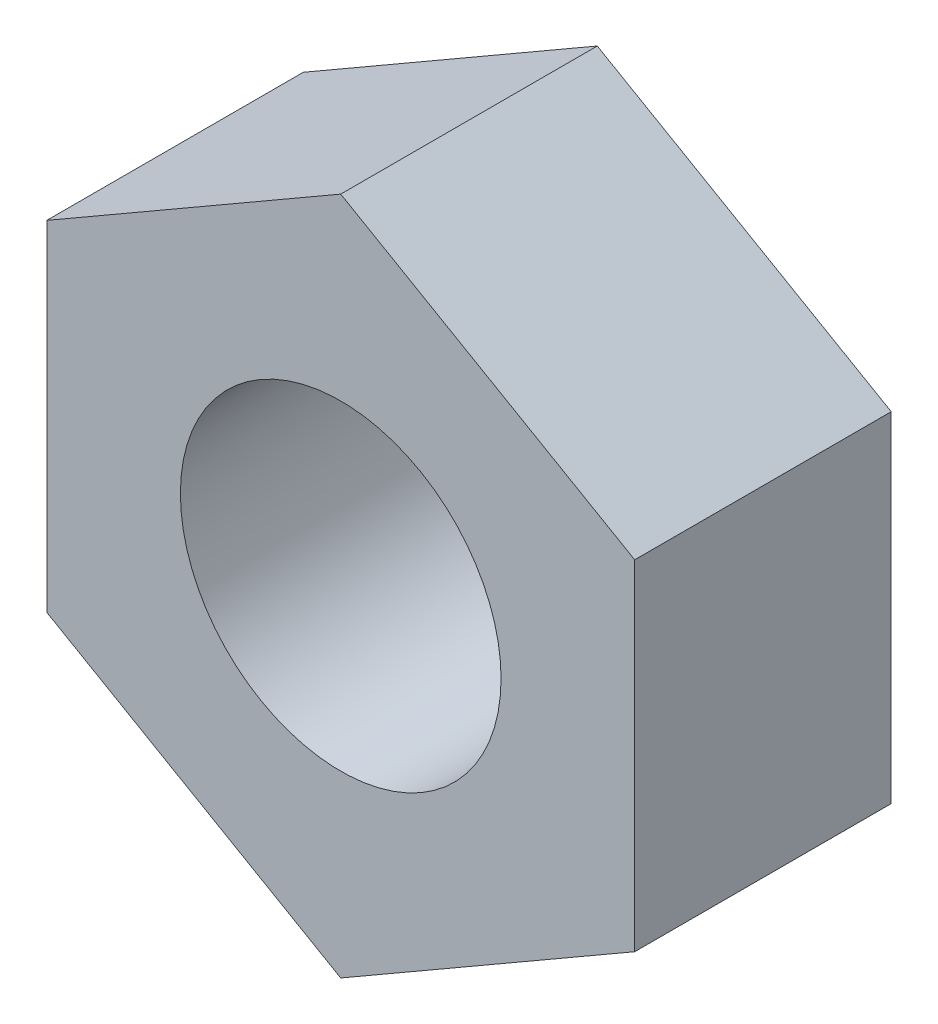
ISO-10303-21;
HEADER;
FILE_DESCRIPTION(('STEP AP214'),'2;1');
FILE_NAME('part.step','',(''),(''),'','','');
FILE_SCHEMA(('AUTOMOTIVE_DESIGN { 1 0 10303 214 1 1 1 1 }'));
ENDSEC;
DATA;
#1=APPLICATION_CONTEXT('core data for automotive mechanical design processes');
#2=APPLICATION_PROTOCOL_DEFINITION('international standard','automotive_design',2000,#1);
#3=PRODUCT_CONTEXT('',#1,'mechanical');
#4=PRODUCT('Part','Part','',(#3));
#5=PRODUCT_RELATED_PRODUCT_CATEGORY('part','',(#4));
#6=PRODUCT_DEFINITION_FORMATION('','',#4);
#7=PRODUCT_DEFINITION_CONTEXT('part definition',#1,'design');
#8=PRODUCT_DEFINITION('design','',#6,#7);
#9=PRODUCT_DEFINITION_SHAPE('','',#8);
#10=(LENGTH_UNIT() NAMED_UNIT(*) SI_UNIT(.MILLI.,.METRE.));
#11=(NAMED_UNIT(*) PLANE_ANGLE_UNIT() SI_UNIT($,.RADIAN.));
#12=(NAMED_UNIT(*) SI_UNIT($,.STERADIAN.) SOLID_ANGLE_UNIT());
#13=UNCERTAINTY_MEASURE_WITH_UNIT(LENGTH_MEASURE(1.E-05),#10,'distance_accuracy_value','');
#14=(GEOMETRIC_REPRESENTATION_CONTEXT(3) GLOBAL_UNCERTAINTY_ASSIGNED_CONTEXT((#13)) GLOBAL_UNIT_ASSIGNED_CONTEXT((#10,
#11,#12)) REPRESENTATION_CONTEXT('',''));
#15=CARTESIAN_POINT('',(0.,0.,0.));
#16=DIRECTION('',(0.,0.,1.));
#17=DIRECTION('',(1.,0.,0.));
#18=AXIS2_PLACEMENT_3D('',#15,#16,#17);
#19=CARTESIAN_POINT('',(-2.74999999999998,-1.5877132402715,2.4));
#20=DIRECTION('',(0.499999999999995,0.866025403784441,0.));
#21=DIRECTION('',(-0.866025403784441,0.499999999999995,0.));
#22=AXIS2_PLACEMENT_3D('',#19,#20,#21);
#23=PLANE('',#22);
#24=DIRECTION('',(0.866025403784441,-0.499999999999995,0.));
#25=VECTOR('',#24,1.);
#26=CARTESIAN_POINT('',(-2.74999999999998,-1.5877132402715,0.));
#27=LINE('',#26,#25);
#28=CARTESIAN_POINT('',(-2.74999999999998,-1.5877132402715,0.));
#29=VERTEX_POINT('',#28);
#30=CARTESIAN_POINT('',(0.,-3.17542648054294,0.));
#31=VERTEX_POINT('',#30);
#32=EDGE_CURVE('E134',#29,#31,#27,.T.);
#33=ORIENTED_EDGE('',*,*,#32,.T.);
#34=DIRECTION('',(0.,0.,-1.));
#35=VECTOR('',#34,1.);
#36=CARTESIAN_POINT('',(0.,-3.17542648054294,2.4));
#37=LINE('',#36,#35);
#38=CARTESIAN_POINT('',(0.,-3.17542648054294,2.4));
#39=VERTEX_POINT('',#38);
#40=EDGE_CURVE('E11',#39,#31,#37,.T.);
#41=ORIENTED_EDGE('',*,*,#40,.F.);
#42=DIRECTION('',(0.866025403784441,-0.499999999999995,0.));
#43=VECTOR('',#42,1.);
#44=CARTESIAN_POINT('',(-2.74999999999998,-1.5877132402715,2.4));
#45=LINE('',#44,#43);
#46=CARTESIAN_POINT('',(-2.74999999999998,-1.5877132402715,2.4));
#47=VERTEX_POINT('',#46);
#48=EDGE_CURVE('E147',#47,#39,#45,.T.);
#49=ORIENTED_EDGE('',*,*,#48,.F.);
#50=DIRECTION('',(0.,0.,-1.));
#51=VECTOR('',#50,1.);
#52=CARTESIAN_POINT('',(-2.74999999999998,-1.5877132402715,2.4));
#53=LINE('',#52,#51);
#54=EDGE_CURVE('E127',#47,#29,#53,.T.);
#55=ORIENTED_EDGE('',*,*,#54,.T.);
#56=EDGE_LOOP('',(#33,#41,#49,#55));
#57=FACE_BOUND('',#56,.T.);
#58=ADVANCED_FACE('F43',(#57),#23,.F.);
#59=CARTESIAN_POINT('',(0.,-3.17542648054294,2.4));
#60=DIRECTION('',(-0.500000000000001,0.866025403784438,0.));
#61=DIRECTION('',(-0.866025403784438,-0.500000000000001,0.));
#62=AXIS2_PLACEMENT_3D('',#59,#60,#61);
#63=PLANE('',#62);
#64=DIRECTION('',(0.866025403784438,0.500000000000001,0.));
#65=VECTOR('',#64,1.);
#66=CARTESIAN_POINT('',(0.,-3.17542648054294,0.));
#67=LINE('',#66,#65);
#68=CARTESIAN_POINT('',(2.75,-1.58771324027146,0.));
#69=VERTEX_POINT('',#68);
#70=EDGE_CURVE('E136',#31,#69,#67,.T.);
#71=ORIENTED_EDGE('',*,*,#70,.T.);
#72=DIRECTION('',(0.,0.,-1.));
#73=VECTOR('',#72,1.);
#74=CARTESIAN_POINT('',(2.75,-1.58771324027146,2.4));
#75=LINE('',#74,#73);
#76=CARTESIAN_POINT('',(2.75,-1.58771324027146,2.4));
#77=VERTEX_POINT('',#76);
#78=EDGE_CURVE('E55',#77,#69,#75,.T.);
#79=ORIENTED_EDGE('',*,*,#78,.F.);
#80=DIRECTION('',(0.866025403784438,0.500000000000001,0.));
#81=VECTOR('',#80,1.);
#82=CARTESIAN_POINT('',(0.,-3.17542648054294,2.4));
#83=LINE('',#82,#81);
#84=EDGE_CURVE('E97',#39,#77,#83,.T.);
#85=ORIENTED_EDGE('',*,*,#84,.F.);
#86=ORIENTED_EDGE('',*,*,#40,.T.);
#87=EDGE_LOOP('',(#71,#79,#85,#86));
#88=FACE_BOUND('',#87,.T.);
#89=ADVANCED_FACE('F178',(#88),#63,.F.);
#90=CARTESIAN_POINT('',(2.75,-1.58771324027146,2.4));
#91=DIRECTION('',(-1.,0.,0.));
#92=DIRECTION('',(0.,-1.,0.));
#93=AXIS2_PLACEMENT_3D('',#90,#91,#92);
#94=PLANE('',#93);
#95=DIRECTION('',(0.,1.,0.));
#96=VECTOR('',#95,1.);
#97=CARTESIAN_POINT('',(2.75,-1.58771324027146,0.));
#98=LINE('',#97,#96);
#99=CARTESIAN_POINT('',(2.74999999999999,1.58771324027148,0.));
#100=VERTEX_POINT('',#99);
#101=EDGE_CURVE('E145',#69,#100,#98,.T.);
#102=ORIENTED_EDGE('',*,*,#101,.T.);
#103=DIRECTION('',(0.,0.,-1.));
#104=VECTOR('',#103,1.);
#105=CARTESIAN_POINT('',(2.74999999999999,1.58771324027148,2.4));
#106=LINE('',#105,#104);
#107=CARTESIAN_POINT('',(2.74999999999999,1.58771324027148,2.4));
#108=VERTEX_POINT('',#107);
#109=EDGE_CURVE('E122',#108,#100,#106,.T.);
#110=ORIENTED_EDGE('',*,*,#109,.F.);
#111=DIRECTION('',(0.,1.,0.));
#112=VECTOR('',#111,1.);
#113=CARTESIAN_POINT('',(2.75,-1.58771324027146,2.4));
#114=LINE('',#113,#112);
#115=EDGE_CURVE('E109',#77,#108,#114,.T.);
#116=ORIENTED_EDGE('',*,*,#115,.F.);
#117=ORIENTED_EDGE('',*,*,#78,.T.);
#118=EDGE_LOOP('',(#102,#110,#116,#117));
#119=FACE_BOUND('',#118,.T.);
#120=ADVANCED_FACE('F159',(#119),#94,.F.);
#121=CARTESIAN_POINT('',(2.74999999999999,1.58771324027148,2.4));
#122=DIRECTION('',(-0.499999999999995,-0.866025403784441,0.));
#123=DIRECTION('',(0.866025403784442,-0.499999999999995,0.));
#124=AXIS2_PLACEMENT_3D('',#121,#122,#123);
#125=PLANE('',#124);
#126=DIRECTION('',(-0.866025403784441,0.499999999999995,0.));
#127=VECTOR('',#126,1.);
#128=CARTESIAN_POINT('',(2.74999999999999,1.58771324027148,0.));
#129=LINE('',#128,#127);
#130=CARTESIAN_POINT('',(0.,3.17542648054294,0.));
#131=VERTEX_POINT('',#130);
#132=EDGE_CURVE('E118',#100,#131,#129,.T.);
#133=ORIENTED_EDGE('',*,*,#132,.T.);
#134=DIRECTION('',(0.,0.,-1.));
#135=VECTOR('',#134,1.);
#136=CARTESIAN_POINT('',(0.,3.17542648054294,2.4));
#137=LINE('',#136,#135);
#138=CARTESIAN_POINT('',(0.,3.17542648054294,2.4));
#139=VERTEX_POINT('',#138);
#140=EDGE_CURVE('E116',#139,#131,#137,.T.);
#141=ORIENTED_EDGE('',*,*,#140,.F.);
#142=DIRECTION('',(-0.866025403784441,0.499999999999995,0.));
#143=VECTOR('',#142,1.);
#144=CARTESIAN_POINT('',(2.74999999999999,1.58771324027148,2.4));
#145=LINE('',#144,#143);
#146=EDGE_CURVE('E104',#108,#139,#145,.T.);
#147=ORIENTED_EDGE('',*,*,#146,.F.);
#148=ORIENTED_EDGE('',*,*,#109,.T.);
#149=EDGE_LOOP('',(#133,#141,#147,#148));
#150=FACE_BOUND('',#149,.T.);
#151=ADVANCED_FACE('F120',(#150),#125,.F.);
#152=CARTESIAN_POINT('',(0.,3.17542648054294,2.4));
#153=DIRECTION('',(0.500000000000007,-0.866025403784434,0.));
#154=DIRECTION('',(0.866025403784435,0.500000000000007,0.));
#155=AXIS2_PLACEMENT_3D('',#152,#153,#154);
#156=PLANE('',#155);
#157=DIRECTION('',(-0.866025403784435,-0.500000000000007,0.));
#158=VECTOR('',#157,1.);
#159=CARTESIAN_POINT('',(0.,3.17542648054294,0.));
#160=LINE('',#159,#158);
#161=CARTESIAN_POINT('',(-2.75000000000001,1.58771324027145,0.));
#162=VERTEX_POINT('',#161);
#163=EDGE_CURVE('E85',#131,#162,#160,.T.);
#164=ORIENTED_EDGE('',*,*,#163,.T.);
#165=DIRECTION('',(0.,0.,-1.));
#166=VECTOR('',#165,1.);
#167=CARTESIAN_POINT('',(-2.75000000000001,1.58771324027145,2.4));
#168=LINE('',#167,#166);
#169=CARTESIAN_POINT('',(-2.75000000000001,1.58771324027145,2.4));
#170=VERTEX_POINT('',#169);
#171=EDGE_CURVE('E125',#170,#162,#168,.T.);
#172=ORIENTED_EDGE('',*,*,#171,.F.);
#173=DIRECTION('',(-0.866025403784435,-0.500000000000007,0.));
#174=VECTOR('',#173,1.);
#175=CARTESIAN_POINT('',(0.,3.17542648054294,2.4));
#176=LINE('',#175,#174);
#177=EDGE_CURVE('E108',#139,#170,#176,.T.);
#178=ORIENTED_EDGE('',*,*,#177,.F.);
#179=ORIENTED_EDGE('',*,*,#140,.T.);
#180=EDGE_LOOP('',(#164,#172,#178,#179));
#181=FACE_BOUND('',#180,.T.);
#182=ADVANCED_FACE('F121',(#181),#156,.F.);
#183=CARTESIAN_POINT('',(-2.75000000000001,1.58771324027145,2.4));
#184=DIRECTION('',(1.,0.,0.));
#185=DIRECTION('',(0.,1.,0.));
#186=AXIS2_PLACEMENT_3D('',#183,#184,#185);
#187=PLANE('',#186);
#188=DIRECTION('',(0.,-1.,0.));
#189=VECTOR('',#188,1.);
#190=CARTESIAN_POINT('',(-2.75000000000001,1.58771324027145,0.));
#191=LINE('',#190,#189);
#192=EDGE_CURVE('E89',#162,#29,#191,.T.);
#193=ORIENTED_EDGE('',*,*,#192,.T.);
#194=ORIENTED_EDGE('',*,*,#54,.F.);
#195=DIRECTION('',(0.,-1.,0.));
#196=VECTOR('',#195,1.);
#197=CARTESIAN_POINT('',(-2.75000000000001,1.58771324027145,2.4));
#198=LINE('',#197,#196);
#199=EDGE_CURVE('E58',#170,#47,#198,.T.);
#200=ORIENTED_EDGE('',*,*,#199,.F.);
#201=ORIENTED_EDGE('',*,*,#171,.T.);
#202=EDGE_LOOP('',(#193,#194,#200,#201));
#203=FACE_BOUND('',#202,.T.);
#204=ADVANCED_FACE('F170',(#203),#187,.F.);
#205=CARTESIAN_POINT('',(0.,0.,2.4));
#206=DIRECTION('',(0.,0.,1.));
#207=DIRECTION('',(1.,0.,0.));
#208=AXIS2_PLACEMENT_3D('',#205,#206,#207);
#209=PLANE('',#208);
#210=CARTESIAN_POINT('',(0.,0.,2.4));
#211=DIRECTION('',(0.,0.,1.));
#212=DIRECTION('',(1.,0.,0.));
#213=AXIS2_PLACEMENT_3D('',#210,#211,#212);
#214=CIRCLE('',#213,1.5);
#215=CARTESIAN_POINT('',(1.5,0.,2.4));
#216=VERTEX_POINT('',#215);
#217=EDGE_CURVE('E137',#216,#216,#214,.T.);
#218=ORIENTED_EDGE('',*,*,#217,.F.);
#219=EDGE_LOOP('',(#218));
#220=FACE_BOUND('',#219,.T.);
#221=ORIENTED_EDGE('',*,*,#48,.T.);
#222=ORIENTED_EDGE('',*,*,#84,.T.);
#223=ORIENTED_EDGE('',*,*,#115,.T.);
#224=ORIENTED_EDGE('',*,*,#146,.T.);
#225=ORIENTED_EDGE('',*,*,#177,.T.);
#226=ORIENTED_EDGE('',*,*,#199,.T.);
#227=EDGE_LOOP('',(#221,#222,#223,#224,#225,#226));
#228=FACE_BOUND('',#227,.T.);
#229=ADVANCED_FACE('F106',(#220,#228),#209,.T.);
#230=CARTESIAN_POINT('',(0.,0.,0.));
#231=DIRECTION('',(0.,0.,1.));
#232=DIRECTION('',(1.,0.,0.));
#233=AXIS2_PLACEMENT_3D('',#230,#231,#232);
#234=PLANE('',#233);
#235=CARTESIAN_POINT('',(0.,0.,0.));
#236=DIRECTION('',(0.,0.,1.));
#237=DIRECTION('',(1.,0.,0.));
#238=AXIS2_PLACEMENT_3D('',#235,#236,#237);
#239=CIRCLE('',#238,1.5);
#240=CARTESIAN_POINT('',(1.5,0.,0.));
#241=VERTEX_POINT('',#240);
#242=EDGE_CURVE('E256',#241,#241,#239,.T.);
#243=ORIENTED_EDGE('',*,*,#242,.T.);
#244=EDGE_LOOP('',(#243));
#245=FACE_BOUND('',#244,.T.);
#246=ORIENTED_EDGE('',*,*,#32,.F.);
#247=ORIENTED_EDGE('',*,*,#192,.F.);
#248=ORIENTED_EDGE('',*,*,#163,.F.);
#249=ORIENTED_EDGE('',*,*,#132,.F.);
#250=ORIENTED_EDGE('',*,*,#101,.F.);
#251=ORIENTED_EDGE('',*,*,#70,.F.);
#252=EDGE_LOOP('',(#246,#247,#248,#249,#250,#251));
#253=FACE_BOUND('',#252,.T.);
#254=ADVANCED_FACE('F161',(#245,#253),#234,.F.);
#255=CARTESIAN_POINT('',(0.,0.,2.4));
#256=DIRECTION('',(0.,0.,-1.));
#257=DIRECTION('',(-1.,0.,0.));
#258=AXIS2_PLACEMENT_3D('',#255,#256,#257);
#259=CYLINDRICAL_SURFACE('',#258,1.5);
#260=ORIENTED_EDGE('',*,*,#217,.T.);
#261=EDGE_LOOP('',(#260));
#262=FACE_BOUND('',#261,.T.);
#263=ORIENTED_EDGE('',*,*,#242,.F.);
#264=EDGE_LOOP('',(#263));
#265=FACE_BOUND('',#264,.T.);
#266=ADVANCED_FACE('F211',(#262,#265),#259,.F.);
#267=CLOSED_SHELL('',(#58,#89,#120,#151,#182,#204,#229,#254,#266));
#268=MANIFOLD_SOLID_BREP('B2',#267);
#269=ADVANCED_BREP_SHAPE_REPRESENTATION('',(#18,#268),#14);
#270=SHAPE_DEFINITION_REPRESENTATION(#9,#269);
ENDSEC;
END-ISO-10303-21;
